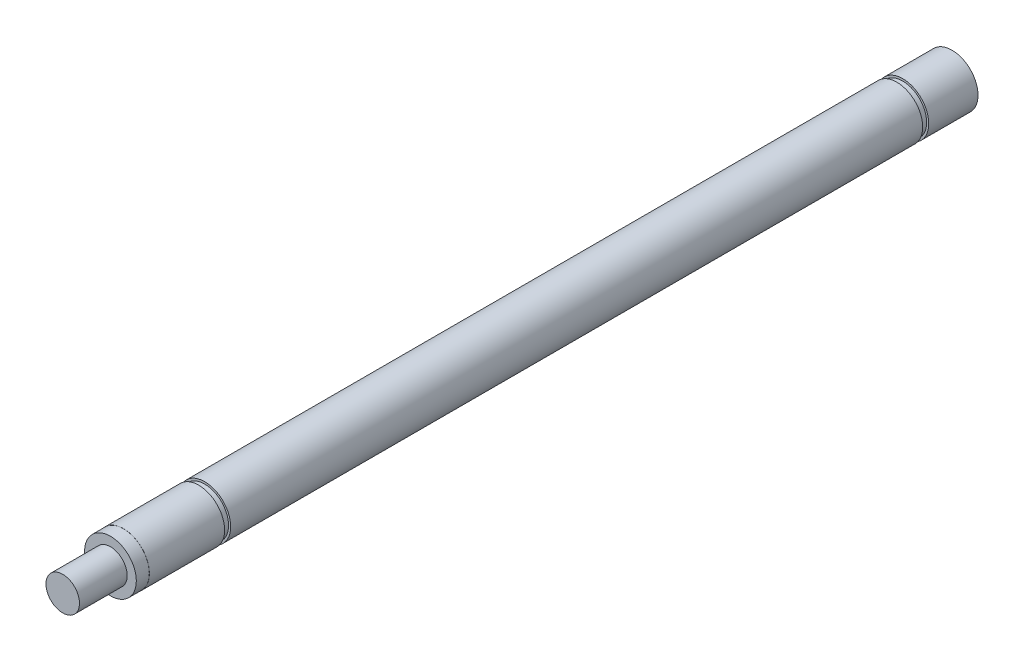
ISO-10303-21;
HEADER;
FILE_DESCRIPTION(('STEP AP214'),'2;1');
FILE_NAME('part.step','',(''),(''),'','','');
FILE_SCHEMA(('AUTOMOTIVE_DESIGN { 1 0 10303 214 1 1 1 1 }'));
ENDSEC;
DATA;
#1=APPLICATION_CONTEXT('core data for automotive mechanical design processes');
#2=APPLICATION_PROTOCOL_DEFINITION('international standard','automotive_design',2000,#1);
#3=PRODUCT_CONTEXT('',#1,'mechanical');
#4=PRODUCT('Part','Part','',(#3));
#5=PRODUCT_RELATED_PRODUCT_CATEGORY('part','',(#4));
#6=PRODUCT_DEFINITION_FORMATION('','',#4);
#7=PRODUCT_DEFINITION_CONTEXT('part definition',#1,'design');
#8=PRODUCT_DEFINITION('design','',#6,#7);
#9=PRODUCT_DEFINITION_SHAPE('','',#8);
#10=(LENGTH_UNIT() NAMED_UNIT(*) SI_UNIT(.MILLI.,.METRE.));
#11=(NAMED_UNIT(*) PLANE_ANGLE_UNIT() SI_UNIT($,.RADIAN.));
#12=(NAMED_UNIT(*) SI_UNIT($,.STERADIAN.) SOLID_ANGLE_UNIT());
#13=UNCERTAINTY_MEASURE_WITH_UNIT(LENGTH_MEASURE(1.E-05),#10,'distance_accuracy_value','');
#14=(GEOMETRIC_REPRESENTATION_CONTEXT(3) GLOBAL_UNCERTAINTY_ASSIGNED_CONTEXT((#13)) GLOBAL_UNIT_ASSIGNED_CONTEXT((#10,
#11,#12)) REPRESENTATION_CONTEXT('',''));
#15=CARTESIAN_POINT('',(0.,0.,0.));
#16=DIRECTION('',(0.,0.,1.));
#17=DIRECTION('',(1.,0.,0.));
#18=AXIS2_PLACEMENT_3D('',#15,#16,#17);
#19=CARTESIAN_POINT('',(0.,0.,9.01700000000009));
#20=DIRECTION('',(0.,0.,1.));
#21=DIRECTION('',(1.,0.,0.));
#22=AXIS2_PLACEMENT_3D('',#19,#20,#21);
#23=CYLINDRICAL_SURFACE('',#22,3.175);
#24=CARTESIAN_POINT('',(0.,0.,-99.7955536822281));
#25=DIRECTION('',(0.,0.,1.));
#26=DIRECTION('',(1.,0.,0.));
#27=AXIS2_PLACEMENT_3D('',#24,#25,#26);
#28=CIRCLE('',#27,3.175);
#29=CARTESIAN_POINT('',(3.175,0.,-99.7955536822281));
#30=VERTEX_POINT('',#29);
#31=EDGE_CURVE('E12',#30,#30,#28,.T.);
#32=ORIENTED_EDGE('',*,*,#31,.T.);
#33=EDGE_LOOP('',(#32));
#34=FACE_BOUND('',#33,.T.);
#35=CARTESIAN_POINT('',(0.,0.,-93.7694036822282));
#36=DIRECTION('',(0.,0.,1.));
#37=DIRECTION('',(1.,0.,0.));
#38=AXIS2_PLACEMENT_3D('',#35,#36,#37);
#39=CIRCLE('',#38,3.175);
#40=CARTESIAN_POINT('',(3.175,0.,-93.7694036822282));
#41=VERTEX_POINT('',#40);
#42=EDGE_CURVE('E86',#41,#41,#39,.T.);
#43=ORIENTED_EDGE('',*,*,#42,.F.);
#44=EDGE_LOOP('',(#43));
#45=FACE_BOUND('',#44,.T.);
#46=ADVANCED_FACE('F40',(#34,#45),#23,.T.);
#47=CARTESIAN_POINT('',(3.175,0.,-99.7955536822281));
#48=DIRECTION('',(0.,0.,-1.));
#49=DIRECTION('',(-1.,0.,0.));
#50=AXIS2_PLACEMENT_3D('',#47,#48,#49);
#51=PLANE('',#50);
#52=ORIENTED_EDGE('',*,*,#31,.F.);
#53=EDGE_LOOP('',(#52));
#54=FACE_BOUND('',#53,.T.);
#55=ADVANCED_FACE('F94',(#54),#51,.T.);
#56=CARTESIAN_POINT('',(2.05,0.,9.01700000000009));
#57=DIRECTION('',(0.,0.,1.));
#58=DIRECTION('',(1.,0.,0.));
#59=AXIS2_PLACEMENT_3D('',#56,#57,#58);
#60=PLANE('',#59);
#61=CARTESIAN_POINT('',(0.,0.,9.01700000000009));
#62=DIRECTION('',(0.,0.,1.));
#63=DIRECTION('',(1.,0.,0.));
#64=AXIS2_PLACEMENT_3D('',#61,#62,#63);
#65=CIRCLE('',#64,2.05);
#66=CARTESIAN_POINT('',(2.05,0.,9.01700000000009));
#67=VERTEX_POINT('',#66);
#68=EDGE_CURVE('E46',#67,#67,#65,.T.);
#69=ORIENTED_EDGE('',*,*,#68,.T.);
#70=EDGE_LOOP('',(#69));
#71=FACE_BOUND('',#70,.T.);
#72=ADVANCED_FACE('F98',(#71),#60,.T.);
#73=CARTESIAN_POINT('',(0.,0.,9.01700000000009));
#74=DIRECTION('',(0.,0.,1.));
#75=DIRECTION('',(1.,0.,0.));
#76=AXIS2_PLACEMENT_3D('',#73,#74,#75);
#77=CYLINDRICAL_SURFACE('',#76,2.05);
#78=CARTESIAN_POINT('',(0.,0.,3.17500000000009));
#79=DIRECTION('',(0.,0.,1.));
#80=DIRECTION('',(1.,0.,0.));
#81=AXIS2_PLACEMENT_3D('',#78,#79,#80);
#82=CIRCLE('',#81,2.05);
#83=CARTESIAN_POINT('',(2.05,0.,3.17500000000009));
#84=VERTEX_POINT('',#83);
#85=EDGE_CURVE('E50',#84,#84,#82,.T.);
#86=ORIENTED_EDGE('',*,*,#85,.T.);
#87=EDGE_LOOP('',(#86));
#88=FACE_BOUND('',#87,.T.);
#89=ORIENTED_EDGE('',*,*,#68,.F.);
#90=EDGE_LOOP('',(#89));
#91=FACE_BOUND('',#90,.T.);
#92=ADVANCED_FACE('F103',(#88,#91),#77,.T.);
#93=CARTESIAN_POINT('',(3.1623,0.,3.17500000000004));
#94=DIRECTION('',(0.,0.,1.));
#95=DIRECTION('',(1.,0.,0.));
#96=AXIS2_PLACEMENT_3D('',#93,#94,#95);
#97=PLANE('',#96);
#98=CARTESIAN_POINT('',(0.,0.,3.17499999999999));
#99=DIRECTION('',(0.,0.,1.));
#100=DIRECTION('',(1.,0.,0.));
#101=AXIS2_PLACEMENT_3D('',#98,#99,#100);
#102=CIRCLE('',#101,3.1623);
#103=CARTESIAN_POINT('',(3.1623,0.,3.17499999999999));
#104=VERTEX_POINT('',#103);
#105=EDGE_CURVE('E54',#104,#104,#102,.T.);
#106=ORIENTED_EDGE('',*,*,#105,.T.);
#107=EDGE_LOOP('',(#106));
#108=FACE_BOUND('',#107,.T.);
#109=ORIENTED_EDGE('',*,*,#85,.F.);
#110=EDGE_LOOP('',(#109));
#111=FACE_BOUND('',#110,.T.);
#112=ADVANCED_FACE('F108',(#108,#111),#97,.T.);
#113=CARTESIAN_POINT('',(0.,0.,9.01700000000009));
#114=DIRECTION('',(0.,0.,1.));
#115=DIRECTION('',(1.,0.,0.));
#116=AXIS2_PLACEMENT_3D('',#113,#114,#115);
#117=CYLINDRICAL_SURFACE('',#116,3.1623);
#118=CARTESIAN_POINT('',(0.,0.,1.5875));
#119=DIRECTION('',(0.,0.,1.));
#120=DIRECTION('',(1.,0.,0.));
#121=AXIS2_PLACEMENT_3D('',#118,#119,#120);
#122=CIRCLE('',#121,3.1623);
#123=CARTESIAN_POINT('',(3.1623,0.,1.5875));
#124=VERTEX_POINT('',#123);
#125=EDGE_CURVE('E59',#124,#124,#122,.T.);
#126=ORIENTED_EDGE('',*,*,#125,.T.);
#127=EDGE_LOOP('',(#126));
#128=FACE_BOUND('',#127,.T.);
#129=ORIENTED_EDGE('',*,*,#105,.F.);
#130=EDGE_LOOP('',(#129));
#131=FACE_BOUND('',#130,.T.);
#132=ADVANCED_FACE('F112',(#128,#131),#117,.T.);
#133=CARTESIAN_POINT('',(3.175,0.,1.5875));
#134=DIRECTION('',(0.,0.,1.));
#135=DIRECTION('',(1.,0.,0.));
#136=AXIS2_PLACEMENT_3D('',#133,#134,#135);
#137=PLANE('',#136);
#138=CARTESIAN_POINT('',(0.,0.,1.5875));
#139=DIRECTION('',(0.,0.,1.));
#140=DIRECTION('',(1.,0.,0.));
#141=AXIS2_PLACEMENT_3D('',#138,#139,#140);
#142=CIRCLE('',#141,3.175);
#143=CARTESIAN_POINT('',(3.175,0.,1.5875));
#144=VERTEX_POINT('',#143);
#145=EDGE_CURVE('E62',#144,#144,#142,.T.);
#146=ORIENTED_EDGE('',*,*,#145,.T.);
#147=EDGE_LOOP('',(#146));
#148=FACE_BOUND('',#147,.T.);
#149=ORIENTED_EDGE('',*,*,#125,.F.);
#150=EDGE_LOOP('',(#149));
#151=FACE_BOUND('',#150,.T.);
#152=ADVANCED_FACE('F116',(#148,#151),#137,.T.);
#153=CARTESIAN_POINT('',(0.,0.,9.01700000000009));
#154=DIRECTION('',(0.,0.,1.));
#155=DIRECTION('',(1.,0.,0.));
#156=AXIS2_PLACEMENT_3D('',#153,#154,#155);
#157=CYLINDRICAL_SURFACE('',#156,3.175);
#158=CARTESIAN_POINT('',(0.,0.,-7.62000000000001));
#159=DIRECTION('',(0.,0.,1.));
#160=DIRECTION('',(1.,0.,0.));
#161=AXIS2_PLACEMENT_3D('',#158,#159,#160);
#162=CIRCLE('',#161,3.175);
#163=CARTESIAN_POINT('',(3.175,0.,-7.62000000000001));
#164=VERTEX_POINT('',#163);
#165=EDGE_CURVE('E65',#164,#164,#162,.T.);
#166=ORIENTED_EDGE('',*,*,#165,.T.);
#167=EDGE_LOOP('',(#166));
#168=FACE_BOUND('',#167,.T.);
#169=ORIENTED_EDGE('',*,*,#145,.F.);
#170=EDGE_LOOP('',(#169));
#171=FACE_BOUND('',#170,.T.);
#172=ADVANCED_FACE('F120',(#168,#171),#157,.T.);
#173=CARTESIAN_POINT('',(3.175,0.,-7.62000000000001));
#174=DIRECTION('',(0.,0.,-1.));
#175=DIRECTION('',(-1.,0.,0.));
#176=AXIS2_PLACEMENT_3D('',#173,#174,#175);
#177=PLANE('',#176);
#178=CARTESIAN_POINT('',(0.,0.,-7.62000000000001));
#179=DIRECTION('',(0.,0.,1.));
#180=DIRECTION('',(1.,0.,0.));
#181=AXIS2_PLACEMENT_3D('',#178,#179,#180);
#182=CIRCLE('',#181,2.921);
#183=CARTESIAN_POINT('',(2.921,0.,-7.62000000000001));
#184=VERTEX_POINT('',#183);
#185=EDGE_CURVE('E68',#184,#184,#182,.T.);
#186=ORIENTED_EDGE('',*,*,#185,.T.);
#187=EDGE_LOOP('',(#186));
#188=FACE_BOUND('',#187,.T.);
#189=ORIENTED_EDGE('',*,*,#165,.F.);
#190=EDGE_LOOP('',(#189));
#191=FACE_BOUND('',#190,.T.);
#192=ADVANCED_FACE('F124',(#188,#191),#177,.T.);
#193=CARTESIAN_POINT('',(0.,0.,9.01700000000009));
#194=DIRECTION('',(0.,0.,1.));
#195=DIRECTION('',(1.,0.,0.));
#196=AXIS2_PLACEMENT_3D('',#193,#194,#195);
#197=CYLINDRICAL_SURFACE('',#196,2.921);
#198=CARTESIAN_POINT('',(0.,0.,-8.35660000000001));
#199=DIRECTION('',(0.,0.,1.));
#200=DIRECTION('',(1.,0.,0.));
#201=AXIS2_PLACEMENT_3D('',#198,#199,#200);
#202=CIRCLE('',#201,2.921);
#203=CARTESIAN_POINT('',(2.921,0.,-8.35660000000001));
#204=VERTEX_POINT('',#203);
#205=EDGE_CURVE('E71',#204,#204,#202,.T.);
#206=ORIENTED_EDGE('',*,*,#205,.T.);
#207=EDGE_LOOP('',(#206));
#208=FACE_BOUND('',#207,.T.);
#209=ORIENTED_EDGE('',*,*,#185,.F.);
#210=EDGE_LOOP('',(#209));
#211=FACE_BOUND('',#210,.T.);
#212=ADVANCED_FACE('F128',(#208,#211),#197,.T.);
#213=CARTESIAN_POINT('',(3.175,0.,-8.35660000000001));
#214=DIRECTION('',(0.,0.,1.));
#215=DIRECTION('',(1.,0.,0.));
#216=AXIS2_PLACEMENT_3D('',#213,#214,#215);
#217=PLANE('',#216);
#218=CARTESIAN_POINT('',(0.,0.,-8.35660000000001));
#219=DIRECTION('',(0.,0.,1.));
#220=DIRECTION('',(1.,0.,0.));
#221=AXIS2_PLACEMENT_3D('',#218,#219,#220);
#222=CIRCLE('',#221,3.175);
#223=CARTESIAN_POINT('',(3.175,0.,-8.35660000000001));
#224=VERTEX_POINT('',#223);
#225=EDGE_CURVE('E74',#224,#224,#222,.T.);
#226=ORIENTED_EDGE('',*,*,#225,.T.);
#227=EDGE_LOOP('',(#226));
#228=FACE_BOUND('',#227,.T.);
#229=ORIENTED_EDGE('',*,*,#205,.F.);
#230=EDGE_LOOP('',(#229));
#231=FACE_BOUND('',#230,.T.);
#232=ADVANCED_FACE('F132',(#228,#231),#217,.T.);
#233=CARTESIAN_POINT('',(0.,0.,9.01700000000009));
#234=DIRECTION('',(0.,0.,1.));
#235=DIRECTION('',(1.,0.,0.));
#236=AXIS2_PLACEMENT_3D('',#233,#234,#235);
#237=CYLINDRICAL_SURFACE('',#236,3.175);
#238=CARTESIAN_POINT('',(0.,0.,-93.0328036822282));
#239=DIRECTION('',(0.,0.,1.));
#240=DIRECTION('',(1.,0.,0.));
#241=AXIS2_PLACEMENT_3D('',#238,#239,#240);
#242=CIRCLE('',#241,3.175);
#243=CARTESIAN_POINT('',(3.175,0.,-93.0328036822282));
#244=VERTEX_POINT('',#243);
#245=EDGE_CURVE('E77',#244,#244,#242,.T.);
#246=ORIENTED_EDGE('',*,*,#245,.T.);
#247=EDGE_LOOP('',(#246));
#248=FACE_BOUND('',#247,.T.);
#249=ORIENTED_EDGE('',*,*,#225,.F.);
#250=EDGE_LOOP('',(#249));
#251=FACE_BOUND('',#250,.T.);
#252=ADVANCED_FACE('F136',(#248,#251),#237,.T.);
#253=CARTESIAN_POINT('',(3.175,0.,-93.0328036822282));
#254=DIRECTION('',(0.,0.,-1.));
#255=DIRECTION('',(-1.,0.,0.));
#256=AXIS2_PLACEMENT_3D('',#253,#254,#255);
#257=PLANE('',#256);
#258=CARTESIAN_POINT('',(0.,0.,-93.0328036822282));
#259=DIRECTION('',(0.,0.,1.));
#260=DIRECTION('',(1.,0.,0.));
#261=AXIS2_PLACEMENT_3D('',#258,#259,#260);
#262=CIRCLE('',#261,2.921);
#263=CARTESIAN_POINT('',(2.921,0.,-93.0328036822282));
#264=VERTEX_POINT('',#263);
#265=EDGE_CURVE('E80',#264,#264,#262,.T.);
#266=ORIENTED_EDGE('',*,*,#265,.T.);
#267=EDGE_LOOP('',(#266));
#268=FACE_BOUND('',#267,.T.);
#269=ORIENTED_EDGE('',*,*,#245,.F.);
#270=EDGE_LOOP('',(#269));
#271=FACE_BOUND('',#270,.T.);
#272=ADVANCED_FACE('F140',(#268,#271),#257,.T.);
#273=CARTESIAN_POINT('',(0.,0.,9.01700000000009));
#274=DIRECTION('',(0.,0.,1.));
#275=DIRECTION('',(1.,0.,0.));
#276=AXIS2_PLACEMENT_3D('',#273,#274,#275);
#277=CYLINDRICAL_SURFACE('',#276,2.921);
#278=CARTESIAN_POINT('',(0.,0.,-93.7694036822282));
#279=DIRECTION('',(0.,0.,1.));
#280=DIRECTION('',(1.,0.,0.));
#281=AXIS2_PLACEMENT_3D('',#278,#279,#280);
#282=CIRCLE('',#281,2.921);
#283=CARTESIAN_POINT('',(2.921,0.,-93.7694036822282));
#284=VERTEX_POINT('',#283);
#285=EDGE_CURVE('E83',#284,#284,#282,.T.);
#286=ORIENTED_EDGE('',*,*,#285,.T.);
#287=EDGE_LOOP('',(#286));
#288=FACE_BOUND('',#287,.T.);
#289=ORIENTED_EDGE('',*,*,#265,.F.);
#290=EDGE_LOOP('',(#289));
#291=FACE_BOUND('',#290,.T.);
#292=ADVANCED_FACE('F144',(#288,#291),#277,.T.);
#293=CARTESIAN_POINT('',(3.175,0.,-93.7694036822282));
#294=DIRECTION('',(0.,0.,1.));
#295=DIRECTION('',(1.,0.,0.));
#296=AXIS2_PLACEMENT_3D('',#293,#294,#295);
#297=PLANE('',#296);
#298=ORIENTED_EDGE('',*,*,#42,.T.);
#299=EDGE_LOOP('',(#298));
#300=FACE_BOUND('',#299,.T.);
#301=ORIENTED_EDGE('',*,*,#285,.F.);
#302=EDGE_LOOP('',(#301));
#303=FACE_BOUND('',#302,.T.);
#304=ADVANCED_FACE('F90',(#300,#303),#297,.T.);
#305=CLOSED_SHELL('',(#46,#55,#72,#92,#112,#132,#152,#172,#192,#212,#232,#252,#272,#292,#304));
#306=MANIFOLD_SOLID_BREP('B2',#305);
#307=ADVANCED_BREP_SHAPE_REPRESENTATION('',(#18,#306),#14);
#308=SHAPE_DEFINITION_REPRESENTATION(#9,#307);
ENDSEC;
END-ISO-10303-21;
